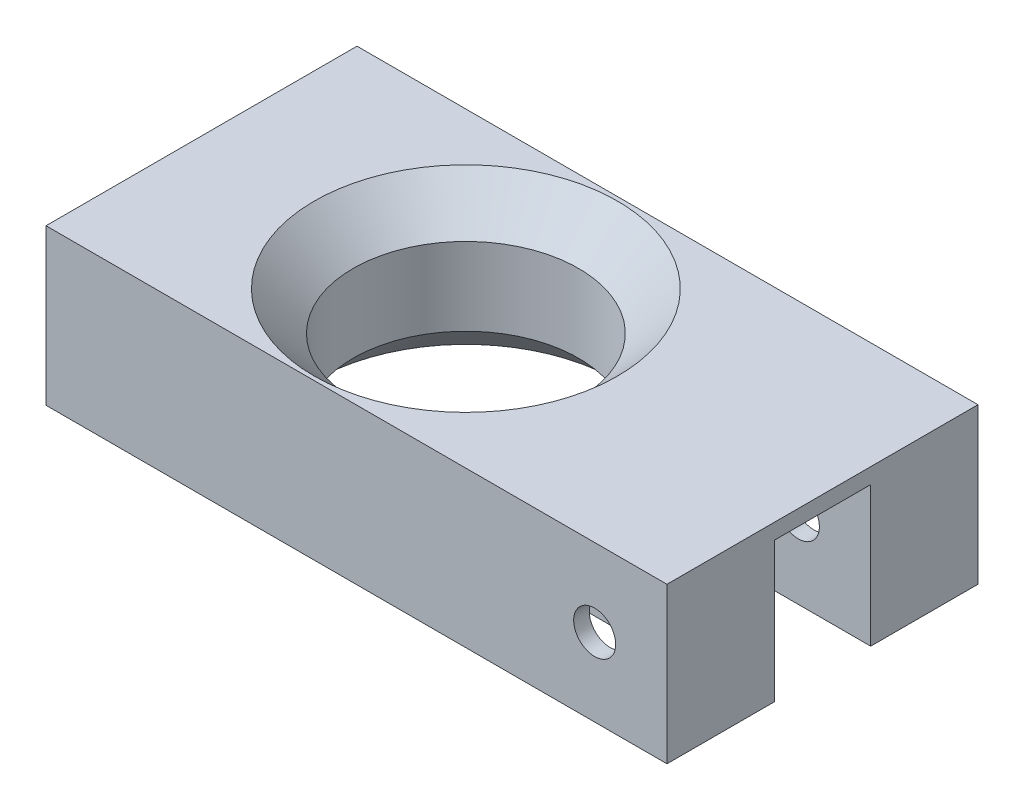
ISO-10303-21;
HEADER;
FILE_DESCRIPTION(('STEP AP214'),'2;1');
FILE_NAME('part.step','',(''),(''),'','','');
FILE_SCHEMA(('AUTOMOTIVE_DESIGN { 1 0 10303 214 1 1 1 1 }'));
ENDSEC;
DATA;
#1=APPLICATION_CONTEXT('core data for automotive mechanical design processes');
#2=APPLICATION_PROTOCOL_DEFINITION('international standard','automotive_design',2000,#1);
#3=PRODUCT_CONTEXT('',#1,'mechanical');
#4=PRODUCT('Part','Part','',(#3));
#5=PRODUCT_RELATED_PRODUCT_CATEGORY('part','',(#4));
#6=PRODUCT_DEFINITION_FORMATION('','',#4);
#7=PRODUCT_DEFINITION_CONTEXT('part definition',#1,'design');
#8=PRODUCT_DEFINITION('design','',#6,#7);
#9=PRODUCT_DEFINITION_SHAPE('','',#8);
#10=(LENGTH_UNIT() NAMED_UNIT(*) SI_UNIT(.MILLI.,.METRE.));
#11=(NAMED_UNIT(*) PLANE_ANGLE_UNIT() SI_UNIT($,.RADIAN.));
#12=(NAMED_UNIT(*) SI_UNIT($,.STERADIAN.) SOLID_ANGLE_UNIT());
#13=UNCERTAINTY_MEASURE_WITH_UNIT(LENGTH_MEASURE(1.E-05),#10,'distance_accuracy_value','');
#14=(GEOMETRIC_REPRESENTATION_CONTEXT(3) GLOBAL_UNCERTAINTY_ASSIGNED_CONTEXT((#13)) GLOBAL_UNIT_ASSIGNED_CONTEXT((#10,
#11,#12)) REPRESENTATION_CONTEXT('',''));
#15=CARTESIAN_POINT('',(0.,0.,0.));
#16=DIRECTION('',(0.,0.,1.));
#17=DIRECTION('',(1.,0.,0.));
#18=AXIS2_PLACEMENT_3D('',#15,#16,#17);
#19=CARTESIAN_POINT('',(0.,10.,39.7015444888983));
#20=DIRECTION('',(0.,0.,-1.));
#21=DIRECTION('',(-1.,0.,0.));
#22=AXIS2_PLACEMENT_3D('',#19,#20,#21);
#23=PLANE('',#22);
#24=CARTESIAN_POINT('',(-2.86835146544696,5.,39.7015444888983));
#25=DIRECTION('',(0.,0.,1.));
#26=DIRECTION('',(1.,0.,0.));
#27=AXIS2_PLACEMENT_3D('',#24,#25,#26);
#28=CIRCLE('',#27,1.35);
#29=CARTESIAN_POINT('',(-1.51835146544696,5.,39.7015444888983));
#30=VERTEX_POINT('',#29);
#31=EDGE_CURVE('E194',#30,#30,#28,.T.);
#32=ORIENTED_EDGE('',*,*,#31,.F.);
#33=EDGE_LOOP('',(#32));
#34=FACE_BOUND('',#33,.T.);
#35=DIRECTION('',(0.,1.,0.));
#36=VECTOR('',#35,1.);
#37=CARTESIAN_POINT('',(-38.1497596240148,10.,39.7015444888983));
#38=LINE('',#37,#36);
#39=CARTESIAN_POINT('',(-38.1497596240148,0.,39.7015444888983));
#40=VERTEX_POINT('',#39);
#41=CARTESIAN_POINT('',(-38.1497596240148,10.,39.7015444888983));
#42=VERTEX_POINT('',#41);
#43=EDGE_CURVE('E314',#40,#42,#38,.T.);
#44=ORIENTED_EDGE('',*,*,#43,.F.);
#45=DIRECTION('',(1.,0.,0.));
#46=VECTOR('',#45,1.);
#47=CARTESIAN_POINT('',(0.,0.,39.7015444888983));
#48=LINE('',#47,#46);
#49=CARTESIAN_POINT('',(1.78164853455304,0.,39.7015444888983));
#50=VERTEX_POINT('',#49);
#51=EDGE_CURVE('E243',#40,#50,#48,.T.);
#52=ORIENTED_EDGE('',*,*,#51,.T.);
#53=DIRECTION('',(0.,1.,0.));
#54=VECTOR('',#53,1.);
#55=CARTESIAN_POINT('',(1.78164853455304,0.,39.7015444888983));
#56=LINE('',#55,#54);
#57=CARTESIAN_POINT('',(1.78164853455304,10.,39.7015444888983));
#58=VERTEX_POINT('',#57);
#59=EDGE_CURVE('E227',#50,#58,#56,.T.);
#60=ORIENTED_EDGE('',*,*,#59,.T.);
#61=DIRECTION('',(1.,0.,0.));
#62=VECTOR('',#61,1.);
#63=CARTESIAN_POINT('',(0.,10.,39.7015444888983));
#64=LINE('',#63,#62);
#65=EDGE_CURVE('E244',#42,#58,#64,.T.);
#66=ORIENTED_EDGE('',*,*,#65,.F.);
#67=EDGE_LOOP('',(#44,#52,#60,#66));
#68=FACE_BOUND('',#67,.T.);
#69=ADVANCED_FACE('F36',(#34,#68),#23,.F.);
#70=CARTESIAN_POINT('',(0.,10.,19.7015444888983));
#71=DIRECTION('',(0.,0.,-1.));
#72=DIRECTION('',(-1.,0.,0.));
#73=AXIS2_PLACEMENT_3D('',#70,#71,#72);
#74=PLANE('',#73);
#75=CARTESIAN_POINT('',(-2.86835146544696,5.,19.7015444888983));
#76=DIRECTION('',(0.,0.,1.));
#77=DIRECTION('',(1.,0.,0.));
#78=AXIS2_PLACEMENT_3D('',#75,#76,#77);
#79=CIRCLE('',#78,1.35);
#80=CARTESIAN_POINT('',(-1.51835146544696,5.,19.7015444888983));
#81=VERTEX_POINT('',#80);
#82=EDGE_CURVE('E198',#81,#81,#79,.T.);
#83=ORIENTED_EDGE('',*,*,#82,.T.);
#84=EDGE_LOOP('',(#83));
#85=FACE_BOUND('',#84,.T.);
#86=DIRECTION('',(1.,0.,0.));
#87=VECTOR('',#86,1.);
#88=CARTESIAN_POINT('',(0.,0.,19.7015444888983));
#89=LINE('',#88,#87);
#90=CARTESIAN_POINT('',(-38.1497596240148,0.,19.7015444888983));
#91=VERTEX_POINT('',#90);
#92=CARTESIAN_POINT('',(1.78164853455304,0.,19.7015444888983));
#93=VERTEX_POINT('',#92);
#94=EDGE_CURVE('E247',#91,#93,#89,.T.);
#95=ORIENTED_EDGE('',*,*,#94,.F.);
#96=DIRECTION('',(0.,-1.,0.));
#97=VECTOR('',#96,1.);
#98=CARTESIAN_POINT('',(-38.1497596240148,10.,19.7015444888983));
#99=LINE('',#98,#97);
#100=CARTESIAN_POINT('',(-38.1497596240148,10.,19.7015444888983));
#101=VERTEX_POINT('',#100);
#102=EDGE_CURVE('E54',#101,#91,#99,.T.);
#103=ORIENTED_EDGE('',*,*,#102,.F.);
#104=DIRECTION('',(1.,0.,0.));
#105=VECTOR('',#104,1.);
#106=CARTESIAN_POINT('',(0.,10.,19.7015444888983));
#107=LINE('',#106,#105);
#108=CARTESIAN_POINT('',(1.78164853455304,10.,19.7015444888983));
#109=VERTEX_POINT('',#108);
#110=EDGE_CURVE('E246',#101,#109,#107,.T.);
#111=ORIENTED_EDGE('',*,*,#110,.T.);
#112=DIRECTION('',(0.,1.,0.));
#113=VECTOR('',#112,1.);
#114=CARTESIAN_POINT('',(1.78164853455304,0.,19.7015444888983));
#115=LINE('',#114,#113);
#116=EDGE_CURVE('E236',#93,#109,#115,.T.);
#117=ORIENTED_EDGE('',*,*,#116,.F.);
#118=EDGE_LOOP('',(#95,#103,#111,#117));
#119=FACE_BOUND('',#118,.T.);
#120=ADVANCED_FACE('F408',(#85,#119),#74,.T.);
#121=CARTESIAN_POINT('',(0.,10.,0.));
#122=DIRECTION('',(0.,1.,0.));
#123=DIRECTION('',(0.,0.,1.));
#124=AXIS2_PLACEMENT_3D('',#121,#122,#123);
#125=PLANE('',#124);
#126=CARTESIAN_POINT('',(-21.1497596240148,10.,29.7015444888983));
#127=DIRECTION('',(0.,1.,0.));
#128=DIRECTION('',(0.,0.,1.));
#129=AXIS2_PLACEMENT_3D('',#126,#127,#128);
#130=CIRCLE('',#129,9.75000000000001);
#131=CARTESIAN_POINT('',(-21.1497596240148,10.,39.4515444888983));
#132=VERTEX_POINT('',#131);
#133=EDGE_CURVE('E46',#132,#132,#130,.F.);
#134=ORIENTED_EDGE('',*,*,#133,.T.);
#135=EDGE_LOOP('',(#134));
#136=FACE_BOUND('',#135,.T.);
#137=ORIENTED_EDGE('',*,*,#110,.F.);
#138=DIRECTION('',(0.,0.,-1.));
#139=VECTOR('',#138,1.);
#140=CARTESIAN_POINT('',(-38.1497596240148,10.,19.7015444888983));
#141=LINE('',#140,#139);
#142=EDGE_CURVE('E316',#42,#101,#141,.T.);
#143=ORIENTED_EDGE('',*,*,#142,.F.);
#144=ORIENTED_EDGE('',*,*,#65,.T.);
#145=DIRECTION('',(0.,0.,1.));
#146=VECTOR('',#145,1.);
#147=CARTESIAN_POINT('',(1.78164853455304,10.,32.8015444888983));
#148=LINE('',#147,#146);
#149=EDGE_CURVE('E239',#109,#58,#148,.T.);
#150=ORIENTED_EDGE('',*,*,#149,.F.);
#151=EDGE_LOOP('',(#137,#143,#144,#150));
#152=FACE_BOUND('',#151,.T.);
#153=ADVANCED_FACE('F415',(#136,#152),#125,.T.);
#154=CARTESIAN_POINT('',(0.,0.,0.));
#155=DIRECTION('',(0.,1.,0.));
#156=DIRECTION('',(0.,0.,1.));
#157=AXIS2_PLACEMENT_3D('',#154,#155,#156);
#158=PLANE('',#157);
#159=CARTESIAN_POINT('',(-21.1497596240148,0.,29.7015444888983));
#160=DIRECTION('',(0.,1.,0.));
#161=DIRECTION('',(0.,0.,1.));
#162=AXIS2_PLACEMENT_3D('',#159,#160,#161);
#163=CIRCLE('',#162,9.75);
#164=CARTESIAN_POINT('',(-21.1497596240148,0.,39.4515444888983));
#165=VERTEX_POINT('',#164);
#166=EDGE_CURVE('E11',#165,#165,#163,.T.);
#167=ORIENTED_EDGE('',*,*,#166,.T.);
#168=EDGE_LOOP('',(#167));
#169=FACE_BOUND('',#168,.T.);
#170=DIRECTION('',(-0.602687911062155,0.,0.79797699331468));
#171=VECTOR('',#170,1.);
#172=CARTESIAN_POINT('',(9.79317869197855,0.,7.39649195149092));
#173=LINE('',#172,#171);
#174=CARTESIAN_POINT('',(-10.1497596240148,0.,33.8015444888983));
#175=VERTEX_POINT('',#174);
#176=CARTESIAN_POINT('',(-13.8505815636769,0.,38.7015444888983));
#177=VERTEX_POINT('',#176);
#178=EDGE_CURVE('E360',#175,#177,#173,.T.);
#179=ORIENTED_EDGE('',*,*,#178,.T.);
#180=DIRECTION('',(-1.,0.,0.));
#181=VECTOR('',#180,1.);
#182=CARTESIAN_POINT('',(0.,0.,38.7015444888983));
#183=LINE('',#182,#181);
#184=CARTESIAN_POINT('',(0.781648534553044,0.,38.7015444888983));
#185=VERTEX_POINT('',#184);
#186=EDGE_CURVE('E318',#185,#177,#183,.T.);
#187=ORIENTED_EDGE('',*,*,#186,.F.);
#188=DIRECTION('',(0.,0.,-1.));
#189=VECTOR('',#188,1.);
#190=CARTESIAN_POINT('',(0.78164853455305,0.,0.));
#191=LINE('',#190,#189);
#192=CARTESIAN_POINT('',(0.781648534553045,0.,33.8015444888983));
#193=VERTEX_POINT('',#192);
#194=EDGE_CURVE('E353',#185,#193,#191,.T.);
#195=ORIENTED_EDGE('',*,*,#194,.T.);
#196=DIRECTION('',(-1.,0.,0.));
#197=VECTOR('',#196,1.);
#198=CARTESIAN_POINT('',(0.,0.,33.8015444888983));
#199=LINE('',#198,#197);
#200=EDGE_CURVE('E363',#193,#175,#199,.T.);
#201=ORIENTED_EDGE('',*,*,#200,.T.);
#202=EDGE_LOOP('',(#179,#187,#195,#201));
#203=FACE_BOUND('',#202,.T.);
#204=DIRECTION('',(0.602687911062155,0.,0.797976993314679));
#205=VECTOR('',#204,1.);
#206=CARTESIAN_POINT('',(-18.7756134717545,0.,14.180653523854));
#207=LINE('',#206,#205);
#208=CARTESIAN_POINT('',(-13.8505815636769,0.,20.7015444888983));
#209=VERTEX_POINT('',#208);
#210=CARTESIAN_POINT('',(-10.1497596240148,0.,25.6015444888983));
#211=VERTEX_POINT('',#210);
#212=EDGE_CURVE('E333',#209,#211,#207,.T.);
#213=ORIENTED_EDGE('',*,*,#212,.T.);
#214=DIRECTION('',(-1.,0.,0.));
#215=VECTOR('',#214,1.);
#216=CARTESIAN_POINT('',(0.,0.,25.6015444888983));
#217=LINE('',#216,#215);
#218=CARTESIAN_POINT('',(0.781648534553044,0.,25.6015444888983));
#219=VERTEX_POINT('',#218);
#220=EDGE_CURVE('E331',#219,#211,#217,.T.);
#221=ORIENTED_EDGE('',*,*,#220,.F.);
#222=DIRECTION('',(0.,0.,1.));
#223=VECTOR('',#222,1.);
#224=CARTESIAN_POINT('',(0.781648534553044,0.,0.));
#225=LINE('',#224,#223);
#226=CARTESIAN_POINT('',(0.781648534553044,0.,20.7015444888983));
#227=VERTEX_POINT('',#226);
#228=EDGE_CURVE('E323',#227,#219,#225,.T.);
#229=ORIENTED_EDGE('',*,*,#228,.F.);
#230=DIRECTION('',(-1.,0.,0.));
#231=VECTOR('',#230,1.);
#232=CARTESIAN_POINT('',(0.,0.,20.7015444888983));
#233=LINE('',#232,#231);
#234=EDGE_CURVE('E337',#227,#209,#233,.T.);
#235=ORIENTED_EDGE('',*,*,#234,.T.);
#236=EDGE_LOOP('',(#213,#221,#229,#235));
#237=FACE_BOUND('',#236,.T.);
#238=DIRECTION('',(0.,0.,1.));
#239=VECTOR('',#238,1.);
#240=CARTESIAN_POINT('',(-38.1497596240148,0.,19.7015444888983));
#241=LINE('',#240,#239);
#242=EDGE_CURVE('E309',#91,#40,#241,.T.);
#243=ORIENTED_EDGE('',*,*,#242,.F.);
#244=ORIENTED_EDGE('',*,*,#94,.T.);
#245=DIRECTION('',(0.,0.,-1.));
#246=VECTOR('',#245,1.);
#247=CARTESIAN_POINT('',(1.78164853455304,0.,26.6015444888983));
#248=LINE('',#247,#246);
#249=CARTESIAN_POINT('',(1.78164853455304,0.,26.6015444888983));
#250=VERTEX_POINT('',#249);
#251=EDGE_CURVE('E230',#250,#93,#248,.T.);
#252=ORIENTED_EDGE('',*,*,#251,.F.);
#253=DIRECTION('',(-1.,0.,0.));
#254=VECTOR('',#253,1.);
#255=CARTESIAN_POINT('',(0.,0.,26.6015444888983));
#256=LINE('',#255,#254);
#257=CARTESIAN_POINT('',(-6.71835146544696,0.,26.6015444888983));
#258=VERTEX_POINT('',#257);
#259=EDGE_CURVE('E257',#250,#258,#256,.T.);
#260=ORIENTED_EDGE('',*,*,#259,.T.);
#261=DIRECTION('',(0.,0.,1.));
#262=VECTOR('',#261,1.);
#263=CARTESIAN_POINT('',(-6.71835146544696,0.,0.));
#264=LINE('',#263,#262);
#265=CARTESIAN_POINT('',(-6.71835146544696,0.,32.8015444888983));
#266=VERTEX_POINT('',#265);
#267=EDGE_CURVE('E254',#258,#266,#264,.T.);
#268=ORIENTED_EDGE('',*,*,#267,.T.);
#269=DIRECTION('',(-1.,0.,0.));
#270=VECTOR('',#269,1.);
#271=CARTESIAN_POINT('',(0.,0.,32.8015444888983));
#272=LINE('',#271,#270);
#273=CARTESIAN_POINT('',(1.78164853455304,0.,32.8015444888983));
#274=VERTEX_POINT('',#273);
#275=EDGE_CURVE('E251',#274,#266,#272,.T.);
#276=ORIENTED_EDGE('',*,*,#275,.F.);
#277=DIRECTION('',(0.,0.,-1.));
#278=VECTOR('',#277,1.);
#279=CARTESIAN_POINT('',(1.78164853455304,0.,32.8015444888983));
#280=LINE('',#279,#278);
#281=EDGE_CURVE('E224',#50,#274,#280,.T.);
#282=ORIENTED_EDGE('',*,*,#281,.F.);
#283=ORIENTED_EDGE('',*,*,#51,.F.);
#284=EDGE_LOOP('',(#243,#244,#252,#260,#268,#276,#282,#283));
#285=FACE_BOUND('',#284,.T.);
#286=ADVANCED_FACE('F384',(#169,#203,#237,#285),#158,.F.);
#287=CARTESIAN_POINT('',(-2.86835146544696,5.,19.7015444888983));
#288=DIRECTION('',(0.,0.,1.));
#289=DIRECTION('',(1.,0.,0.));
#290=AXIS2_PLACEMENT_3D('',#287,#288,#289);
#291=CYLINDRICAL_SURFACE('',#290,1.35);
#292=ORIENTED_EDGE('',*,*,#82,.F.);
#293=EDGE_LOOP('',(#292));
#294=FACE_BOUND('',#293,.T.);
#295=CARTESIAN_POINT('',(-2.86835146544696,5.,20.7015444888983));
#296=DIRECTION('',(0.,0.,1.));
#297=DIRECTION('',(1.,0.,0.));
#298=AXIS2_PLACEMENT_3D('',#295,#296,#297);
#299=CIRCLE('',#298,1.35);
#300=CARTESIAN_POINT('',(-1.51835146544696,5.,20.7015444888983));
#301=VERTEX_POINT('',#300);
#302=EDGE_CURVE('E278',#301,#301,#299,.F.);
#303=ORIENTED_EDGE('',*,*,#302,.F.);
#304=EDGE_LOOP('',(#303));
#305=FACE_BOUND('',#304,.T.);
#306=ADVANCED_FACE('F448',(#294,#305),#291,.F.);
#307=CARTESIAN_POINT('',(-2.86835146544696,5.,32.8015444888983));
#308=DIRECTION('',(0.,0.,1.));
#309=DIRECTION('',(1.,0.,0.));
#310=AXIS2_PLACEMENT_3D('',#307,#308,#309);
#311=CIRCLE('',#310,1.35);
#312=CARTESIAN_POINT('',(-1.51835146544696,5.,32.8015444888983));
#313=VERTEX_POINT('',#312);
#314=EDGE_CURVE('E209',#313,#313,#311,.T.);
#315=ORIENTED_EDGE('',*,*,#314,.F.);
#316=EDGE_LOOP('',(#315));
#317=FACE_BOUND('',#316,.T.);
#318=CARTESIAN_POINT('',(-2.86835146544696,5.,33.8015444888983));
#319=DIRECTION('',(0.,0.,1.));
#320=DIRECTION('',(1.,0.,0.));
#321=AXIS2_PLACEMENT_3D('',#318,#319,#320);
#322=CIRCLE('',#321,1.35);
#323=CARTESIAN_POINT('',(-1.51835146544696,5.,33.8015444888983));
#324=VERTEX_POINT('',#323);
#325=EDGE_CURVE('E272',#324,#324,#322,.F.);
#326=ORIENTED_EDGE('',*,*,#325,.F.);
#327=EDGE_LOOP('',(#326));
#328=FACE_BOUND('',#327,.T.);
#329=ADVANCED_FACE('F455',(#317,#328),#291,.F.);
#330=CARTESIAN_POINT('',(0.,10.,32.8015444888983));
#331=DIRECTION('',(0.,0.,1.));
#332=DIRECTION('',(1.,0.,0.));
#333=AXIS2_PLACEMENT_3D('',#330,#331,#332);
#334=PLANE('',#333);
#335=ORIENTED_EDGE('',*,*,#314,.T.);
#336=EDGE_LOOP('',(#335));
#337=FACE_BOUND('',#336,.T.);
#338=DIRECTION('',(0.,-1.,0.));
#339=VECTOR('',#338,1.);
#340=CARTESIAN_POINT('',(-6.71835146544696,10.,32.8015444888983));
#341=LINE('',#340,#339);
#342=CARTESIAN_POINT('',(-6.71835146544696,9.,32.8015444888983));
#343=VERTEX_POINT('',#342);
#344=EDGE_CURVE('E262',#343,#266,#341,.T.);
#345=ORIENTED_EDGE('',*,*,#344,.F.);
#346=DIRECTION('',(-1.,0.,0.));
#347=VECTOR('',#346,1.);
#348=CARTESIAN_POINT('',(-6.71835146544696,9.,32.8015444888983));
#349=LINE('',#348,#347);
#350=CARTESIAN_POINT('',(1.78164853455304,9.,32.8015444888983));
#351=VERTEX_POINT('',#350);
#352=EDGE_CURVE('E221',#351,#343,#349,.T.);
#353=ORIENTED_EDGE('',*,*,#352,.F.);
#354=DIRECTION('',(0.,1.,0.));
#355=VECTOR('',#354,1.);
#356=CARTESIAN_POINT('',(1.78164853455304,0.,32.8015444888983));
#357=LINE('',#356,#355);
#358=EDGE_CURVE('E228',#274,#351,#357,.T.);
#359=ORIENTED_EDGE('',*,*,#358,.F.);
#360=ORIENTED_EDGE('',*,*,#275,.T.);
#361=EDGE_LOOP('',(#345,#353,#359,#360));
#362=FACE_BOUND('',#361,.T.);
#363=ADVANCED_FACE('F421',(#337,#362),#334,.F.);
#364=CARTESIAN_POINT('',(-6.71835146544696,10.,0.));
#365=DIRECTION('',(1.,0.,0.));
#366=DIRECTION('',(0.,0.,-1.));
#367=AXIS2_PLACEMENT_3D('',#364,#365,#366);
#368=PLANE('',#367);
#369=DIRECTION('',(0.,-1.,0.));
#370=VECTOR('',#369,1.);
#371=CARTESIAN_POINT('',(-6.71835146544696,10.,26.6015444888983));
#372=LINE('',#371,#370);
#373=CARTESIAN_POINT('',(-6.71835146544696,9.,26.6015444888983));
#374=VERTEX_POINT('',#373);
#375=EDGE_CURVE('E249',#374,#258,#372,.T.);
#376=ORIENTED_EDGE('',*,*,#375,.F.);
#377=DIRECTION('',(0.,0.,-1.));
#378=VECTOR('',#377,1.);
#379=CARTESIAN_POINT('',(-6.71835146544696,9.,32.8015444888983));
#380=LINE('',#379,#378);
#381=EDGE_CURVE('E212',#343,#374,#380,.T.);
#382=ORIENTED_EDGE('',*,*,#381,.F.);
#383=ORIENTED_EDGE('',*,*,#344,.T.);
#384=ORIENTED_EDGE('',*,*,#267,.F.);
#385=EDGE_LOOP('',(#376,#382,#383,#384));
#386=FACE_BOUND('',#385,.T.);
#387=ADVANCED_FACE('F463',(#386),#368,.T.);
#388=CARTESIAN_POINT('',(0.,10.,26.6015444888983));
#389=DIRECTION('',(0.,0.,1.));
#390=DIRECTION('',(1.,0.,0.));
#391=AXIS2_PLACEMENT_3D('',#388,#389,#390);
#392=PLANE('',#391);
#393=CARTESIAN_POINT('',(-2.86835146544696,5.,26.6015444888983));
#394=DIRECTION('',(0.,0.,1.));
#395=DIRECTION('',(1.,0.,0.));
#396=AXIS2_PLACEMENT_3D('',#393,#394,#395);
#397=CIRCLE('',#396,1.35);
#398=CARTESIAN_POINT('',(-1.51835146544696,5.,26.6015444888983));
#399=VERTEX_POINT('',#398);
#400=EDGE_CURVE('E205',#399,#399,#397,.T.);
#401=ORIENTED_EDGE('',*,*,#400,.F.);
#402=EDGE_LOOP('',(#401));
#403=FACE_BOUND('',#402,.T.);
#404=ORIENTED_EDGE('',*,*,#259,.F.);
#405=DIRECTION('',(0.,1.,0.));
#406=VECTOR('',#405,1.);
#407=CARTESIAN_POINT('',(1.78164853455304,0.,26.6015444888983));
#408=LINE('',#407,#406);
#409=CARTESIAN_POINT('',(1.78164853455304,9.,26.6015444888983));
#410=VERTEX_POINT('',#409);
#411=EDGE_CURVE('E235',#250,#410,#408,.T.);
#412=ORIENTED_EDGE('',*,*,#411,.T.);
#413=DIRECTION('',(1.,0.,0.));
#414=VECTOR('',#413,1.);
#415=CARTESIAN_POINT('',(-6.71835146544696,9.,26.6015444888983));
#416=LINE('',#415,#414);
#417=EDGE_CURVE('E215',#374,#410,#416,.T.);
#418=ORIENTED_EDGE('',*,*,#417,.F.);
#419=ORIENTED_EDGE('',*,*,#375,.T.);
#420=EDGE_LOOP('',(#404,#412,#418,#419));
#421=FACE_BOUND('',#420,.T.);
#422=ADVANCED_FACE('F436',(#403,#421),#392,.T.);
#423=CARTESIAN_POINT('',(-21.1497596240148,0.,29.7015444888983));
#424=DIRECTION('',(0.,1.,0.));
#425=DIRECTION('',(0.,0.,1.));
#426=AXIS2_PLACEMENT_3D('',#423,#424,#425);
#427=CYLINDRICAL_SURFACE('',#426,7.25);
#428=CARTESIAN_POINT('',(-21.1497596240148,7.49999999999999,29.7015444888983));
#429=DIRECTION('',(0.,1.,0.));
#430=DIRECTION('',(0.,0.,1.));
#431=AXIS2_PLACEMENT_3D('',#428,#429,#430);
#432=CIRCLE('',#431,7.25);
#433=CARTESIAN_POINT('',(-21.1497596240148,7.49999999999999,36.9515444888983));
#434=VERTEX_POINT('',#433);
#435=EDGE_CURVE('E267',#434,#434,#432,.T.);
#436=ORIENTED_EDGE('',*,*,#435,.T.);
#437=EDGE_LOOP('',(#436));
#438=FACE_BOUND('',#437,.T.);
#439=CARTESIAN_POINT('',(-21.1497596240148,2.50000000000001,29.7015444888983));
#440=DIRECTION('',(0.,1.,0.));
#441=DIRECTION('',(0.,0.,1.));
#442=AXIS2_PLACEMENT_3D('',#439,#440,#441);
#443=CIRCLE('',#442,7.25);
#444=CARTESIAN_POINT('',(-21.1497596240148,2.50000000000001,36.9515444888983));
#445=VERTEX_POINT('',#444);
#446=EDGE_CURVE('E264',#445,#445,#443,.F.);
#447=ORIENTED_EDGE('',*,*,#446,.T.);
#448=EDGE_LOOP('',(#447));
#449=FACE_BOUND('',#448,.T.);
#450=ADVANCED_FACE('F428',(#438,#449),#427,.F.);
#451=CARTESIAN_POINT('',(-21.1497596240148,7.49999999999999,29.7015444888983));
#452=DIRECTION('',(0.,1.,0.));
#453=DIRECTION('',(0.,0.,1.));
#454=AXIS2_PLACEMENT_3D('',#451,#452,#453);
#455=CONICAL_SURFACE('',#454,7.25,0.78539816339745);
#456=ORIENTED_EDGE('',*,*,#133,.F.);
#457=EDGE_LOOP('',(#456));
#458=FACE_BOUND('',#457,.T.);
#459=ORIENTED_EDGE('',*,*,#435,.F.);
#460=EDGE_LOOP('',(#459));
#461=FACE_BOUND('',#460,.T.);
#462=ADVANCED_FACE('F424',(#458,#461),#455,.F.);
#463=CARTESIAN_POINT('',(-21.1497596240148,0.,29.7015444888983));
#464=DIRECTION('',(0.,-1.,0.));
#465=DIRECTION('',(0.,0.,-1.));
#466=AXIS2_PLACEMENT_3D('',#463,#464,#465);
#467=CONICAL_SURFACE('',#466,9.75,0.785398163397446);
#468=ORIENTED_EDGE('',*,*,#446,.F.);
#469=EDGE_LOOP('',(#468));
#470=FACE_BOUND('',#469,.T.);
#471=ORIENTED_EDGE('',*,*,#166,.F.);
#472=EDGE_LOOP('',(#471));
#473=FACE_BOUND('',#472,.T.);
#474=ADVANCED_FACE('F39',(#470,#473),#467,.F.);
#475=CARTESIAN_POINT('',(1.78164853455304,0.,0.));
#476=DIRECTION('',(1.,0.,0.));
#477=DIRECTION('',(0.,0.,-1.));
#478=AXIS2_PLACEMENT_3D('',#475,#476,#477);
#479=PLANE('',#478);
#480=ORIENTED_EDGE('',*,*,#358,.T.);
#481=DIRECTION('',(0.,0.,1.));
#482=VECTOR('',#481,1.);
#483=CARTESIAN_POINT('',(1.78164853455304,9.,32.8015444888983));
#484=LINE('',#483,#482);
#485=EDGE_CURVE('E218',#410,#351,#484,.T.);
#486=ORIENTED_EDGE('',*,*,#485,.F.);
#487=ORIENTED_EDGE('',*,*,#411,.F.);
#488=ORIENTED_EDGE('',*,*,#251,.T.);
#489=ORIENTED_EDGE('',*,*,#116,.T.);
#490=ORIENTED_EDGE('',*,*,#149,.T.);
#491=ORIENTED_EDGE('',*,*,#59,.F.);
#492=ORIENTED_EDGE('',*,*,#281,.T.);
#493=EDGE_LOOP('',(#480,#486,#487,#488,#489,#490,#491,#492));
#494=FACE_BOUND('',#493,.T.);
#495=ADVANCED_FACE('F434',(#494),#479,.T.);
#496=CARTESIAN_POINT('',(0.,9.,0.));
#497=DIRECTION('',(0.,-1.,0.));
#498=DIRECTION('',(0.,0.,-1.));
#499=AXIS2_PLACEMENT_3D('',#496,#497,#498);
#500=PLANE('',#499);
#501=ORIENTED_EDGE('',*,*,#381,.T.);
#502=ORIENTED_EDGE('',*,*,#417,.T.);
#503=ORIENTED_EDGE('',*,*,#485,.T.);
#504=ORIENTED_EDGE('',*,*,#352,.T.);
#505=EDGE_LOOP('',(#501,#502,#503,#504));
#506=FACE_BOUND('',#505,.T.);
#507=ADVANCED_FACE('F478',(#506),#500,.T.);
#508=CARTESIAN_POINT('',(-2.86835146544696,5.,25.6015444888983));
#509=DIRECTION('',(0.,0.,1.));
#510=DIRECTION('',(1.,0.,0.));
#511=AXIS2_PLACEMENT_3D('',#508,#509,#510);
#512=CIRCLE('',#511,1.35);
#513=CARTESIAN_POINT('',(-1.51835146544696,5.,25.6015444888983));
#514=VERTEX_POINT('',#513);
#515=EDGE_CURVE('E41',#514,#514,#512,.F.);
#516=ORIENTED_EDGE('',*,*,#515,.T.);
#517=EDGE_LOOP('',(#516));
#518=FACE_BOUND('',#517,.T.);
#519=ORIENTED_EDGE('',*,*,#400,.T.);
#520=EDGE_LOOP('',(#519));
#521=FACE_BOUND('',#520,.T.);
#522=ADVANCED_FACE('F458',(#518,#521),#291,.F.);
#523=CARTESIAN_POINT('',(-2.86835146544696,5.,38.7015444888983));
#524=DIRECTION('',(0.,0.,1.));
#525=DIRECTION('',(1.,0.,0.));
#526=AXIS2_PLACEMENT_3D('',#523,#524,#525);
#527=CIRCLE('',#526,1.35);
#528=CARTESIAN_POINT('',(-1.51835146544696,5.,38.7015444888983));
#529=VERTEX_POINT('',#528);
#530=EDGE_CURVE('E275',#529,#529,#527,.F.);
#531=ORIENTED_EDGE('',*,*,#530,.T.);
#532=EDGE_LOOP('',(#531));
#533=FACE_BOUND('',#532,.T.);
#534=ORIENTED_EDGE('',*,*,#31,.T.);
#535=EDGE_LOOP('',(#534));
#536=FACE_BOUND('',#535,.T.);
#537=ADVANCED_FACE('F663',(#533,#536),#291,.F.);
#538=CARTESIAN_POINT('',(0.,9.,38.7015444888983));
#539=DIRECTION('',(0.,0.,1.));
#540=DIRECTION('',(1.,0.,0.));
#541=AXIS2_PLACEMENT_3D('',#538,#539,#540);
#542=PLANE('',#541);
#543=ORIENTED_EDGE('',*,*,#186,.T.);
#544=DIRECTION('',(0.,-1.,0.));
#545=VECTOR('',#544,1.);
#546=CARTESIAN_POINT('',(-13.8505815636769,9.,38.7015444888983));
#547=LINE('',#546,#545);
#548=CARTESIAN_POINT('',(-13.8505815636769,9.,38.7015444888983));
#549=VERTEX_POINT('',#548);
#550=EDGE_CURVE('E292',#549,#177,#547,.T.);
#551=ORIENTED_EDGE('',*,*,#550,.F.);
#552=DIRECTION('',(-1.,0.,0.));
#553=VECTOR('',#552,1.);
#554=CARTESIAN_POINT('',(0.,9.,38.7015444888983));
#555=LINE('',#554,#553);
#556=CARTESIAN_POINT('',(0.781648534553044,9.,38.7015444888983));
#557=VERTEX_POINT('',#556);
#558=EDGE_CURVE('E349',#557,#549,#555,.T.);
#559=ORIENTED_EDGE('',*,*,#558,.F.);
#560=DIRECTION('',(0.,-1.,0.));
#561=VECTOR('',#560,1.);
#562=CARTESIAN_POINT('',(0.781648534553044,9.,38.7015444888983));
#563=LINE('',#562,#561);
#564=EDGE_CURVE('E334',#557,#185,#563,.T.);
#565=ORIENTED_EDGE('',*,*,#564,.T.);
#566=EDGE_LOOP('',(#543,#551,#559,#565));
#567=FACE_BOUND('',#566,.T.);
#568=ORIENTED_EDGE('',*,*,#530,.F.);
#569=EDGE_LOOP('',(#568));
#570=FACE_BOUND('',#569,.T.);
#571=ADVANCED_FACE('F395',(#567,#570),#542,.F.);
#572=CARTESIAN_POINT('',(0.,9.,33.8015444888983));
#573=DIRECTION('',(0.,0.,1.));
#574=DIRECTION('',(1.,0.,0.));
#575=AXIS2_PLACEMENT_3D('',#572,#573,#574);
#576=PLANE('',#575);
#577=ORIENTED_EDGE('',*,*,#200,.F.);
#578=DIRECTION('',(0.,-1.,0.));
#579=VECTOR('',#578,1.);
#580=CARTESIAN_POINT('',(0.781648534553045,9.,33.8015444888983));
#581=LINE('',#580,#579);
#582=CARTESIAN_POINT('',(0.781648534553045,9.,33.8015444888983));
#583=VERTEX_POINT('',#582);
#584=EDGE_CURVE('E369',#583,#193,#581,.T.);
#585=ORIENTED_EDGE('',*,*,#584,.F.);
#586=DIRECTION('',(-1.,0.,0.));
#587=VECTOR('',#586,1.);
#588=CARTESIAN_POINT('',(0.,9.,33.8015444888983));
#589=LINE('',#588,#587);
#590=CARTESIAN_POINT('',(-10.1497596240148,9.,33.8015444888983));
#591=VERTEX_POINT('',#590);
#592=EDGE_CURVE('E355',#583,#591,#589,.T.);
#593=ORIENTED_EDGE('',*,*,#592,.T.);
#594=DIRECTION('',(0.,-1.,0.));
#595=VECTOR('',#594,1.);
#596=CARTESIAN_POINT('',(-10.1497596240148,9.,33.8015444888983));
#597=LINE('',#596,#595);
#598=EDGE_CURVE('E370',#591,#175,#597,.T.);
#599=ORIENTED_EDGE('',*,*,#598,.T.);
#600=EDGE_LOOP('',(#577,#585,#593,#599));
#601=FACE_BOUND('',#600,.T.);
#602=ORIENTED_EDGE('',*,*,#325,.T.);
#603=EDGE_LOOP('',(#602));
#604=FACE_BOUND('',#603,.T.);
#605=ADVANCED_FACE('F388',(#601,#604),#576,.T.);
#606=CARTESIAN_POINT('',(0.78164853455305,9.,0.));
#607=DIRECTION('',(-1.,0.,0.));
#608=DIRECTION('',(0.,0.,1.));
#609=AXIS2_PLACEMENT_3D('',#606,#607,#608);
#610=PLANE('',#609);
#611=ORIENTED_EDGE('',*,*,#194,.F.);
#612=ORIENTED_EDGE('',*,*,#564,.F.);
#613=DIRECTION('',(0.,0.,-1.));
#614=VECTOR('',#613,1.);
#615=CARTESIAN_POINT('',(0.78164853455305,9.,0.));
#616=LINE('',#615,#614);
#617=EDGE_CURVE('E357',#557,#583,#616,.T.);
#618=ORIENTED_EDGE('',*,*,#617,.T.);
#619=ORIENTED_EDGE('',*,*,#584,.T.);
#620=EDGE_LOOP('',(#611,#612,#618,#619));
#621=FACE_BOUND('',#620,.T.);
#622=ADVANCED_FACE('F397',(#621),#610,.T.);
#623=CARTESIAN_POINT('',(9.79317869197855,9.,7.39649195149092));
#624=DIRECTION('',(0.79797699331468,0.,0.602687911062155));
#625=DIRECTION('',(0.602687911062155,0.,-0.79797699331468));
#626=AXIS2_PLACEMENT_3D('',#623,#624,#625);
#627=PLANE('',#626);
#628=ORIENTED_EDGE('',*,*,#178,.F.);
#629=ORIENTED_EDGE('',*,*,#598,.F.);
#630=DIRECTION('',(-0.602687911062155,0.,0.79797699331468));
#631=VECTOR('',#630,1.);
#632=CARTESIAN_POINT('',(9.79317869197855,9.,7.39649195149092));
#633=LINE('',#632,#631);
#634=EDGE_CURVE('E352',#591,#549,#633,.T.);
#635=ORIENTED_EDGE('',*,*,#634,.T.);
#636=ORIENTED_EDGE('',*,*,#550,.T.);
#637=EDGE_LOOP('',(#628,#629,#635,#636));
#638=FACE_BOUND('',#637,.T.);
#639=ADVANCED_FACE('F378',(#638),#627,.T.);
#640=CARTESIAN_POINT('',(0.,9.,0.));
#641=DIRECTION('',(0.,-1.,0.));
#642=DIRECTION('',(0.,0.,-1.));
#643=AXIS2_PLACEMENT_3D('',#640,#641,#642);
#644=PLANE('',#643);
#645=ORIENTED_EDGE('',*,*,#558,.T.);
#646=ORIENTED_EDGE('',*,*,#634,.F.);
#647=ORIENTED_EDGE('',*,*,#592,.F.);
#648=ORIENTED_EDGE('',*,*,#617,.F.);
#649=EDGE_LOOP('',(#645,#646,#647,#648));
#650=FACE_BOUND('',#649,.T.);
#651=ADVANCED_FACE('F394',(#650),#644,.T.);
#652=CARTESIAN_POINT('',(0.,9.,25.6015444888983));
#653=DIRECTION('',(0.,0.,1.));
#654=DIRECTION('',(1.,0.,0.));
#655=AXIS2_PLACEMENT_3D('',#652,#653,#654);
#656=PLANE('',#655);
#657=ORIENTED_EDGE('',*,*,#220,.T.);
#658=DIRECTION('',(0.,-1.,0.));
#659=VECTOR('',#658,1.);
#660=CARTESIAN_POINT('',(-10.1497596240148,9.,25.6015444888983));
#661=LINE('',#660,#659);
#662=CARTESIAN_POINT('',(-10.1497596240148,9.,25.6015444888983));
#663=VERTEX_POINT('',#662);
#664=EDGE_CURVE('E330',#663,#211,#661,.T.);
#665=ORIENTED_EDGE('',*,*,#664,.F.);
#666=DIRECTION('',(-1.,0.,0.));
#667=VECTOR('',#666,1.);
#668=CARTESIAN_POINT('',(0.,9.,25.6015444888983));
#669=LINE('',#668,#667);
#670=CARTESIAN_POINT('',(0.781648534553044,9.,25.6015444888983));
#671=VERTEX_POINT('',#670);
#672=EDGE_CURVE('E319',#671,#663,#669,.T.);
#673=ORIENTED_EDGE('',*,*,#672,.F.);
#674=DIRECTION('',(0.,-1.,0.));
#675=VECTOR('',#674,1.);
#676=CARTESIAN_POINT('',(0.781648534553044,9.,25.6015444888983));
#677=LINE('',#676,#675);
#678=EDGE_CURVE('E276',#671,#219,#677,.T.);
#679=ORIENTED_EDGE('',*,*,#678,.T.);
#680=EDGE_LOOP('',(#657,#665,#673,#679));
#681=FACE_BOUND('',#680,.T.);
#682=ORIENTED_EDGE('',*,*,#515,.F.);
#683=EDGE_LOOP('',(#682));
#684=FACE_BOUND('',#683,.T.);
#685=ADVANCED_FACE('F516',(#681,#684),#656,.F.);
#686=CARTESIAN_POINT('',(0.,9.,20.7015444888983));
#687=DIRECTION('',(0.,0.,1.));
#688=DIRECTION('',(1.,0.,0.));
#689=AXIS2_PLACEMENT_3D('',#686,#687,#688);
#690=PLANE('',#689);
#691=ORIENTED_EDGE('',*,*,#234,.F.);
#692=DIRECTION('',(0.,-1.,0.));
#693=VECTOR('',#692,1.);
#694=CARTESIAN_POINT('',(0.781648534553044,9.,20.7015444888983));
#695=LINE('',#694,#693);
#696=CARTESIAN_POINT('',(0.781648534553044,9.,20.7015444888983));
#697=VERTEX_POINT('',#696);
#698=EDGE_CURVE('E343',#697,#227,#695,.T.);
#699=ORIENTED_EDGE('',*,*,#698,.F.);
#700=DIRECTION('',(-1.,0.,0.));
#701=VECTOR('',#700,1.);
#702=CARTESIAN_POINT('',(0.,9.,20.7015444888983));
#703=LINE('',#702,#701);
#704=CARTESIAN_POINT('',(-13.8505815636769,9.,20.7015444888983));
#705=VERTEX_POINT('',#704);
#706=EDGE_CURVE('E325',#697,#705,#703,.T.);
#707=ORIENTED_EDGE('',*,*,#706,.T.);
#708=DIRECTION('',(0.,-1.,0.));
#709=VECTOR('',#708,1.);
#710=CARTESIAN_POINT('',(-13.8505815636769,9.,20.7015444888983));
#711=LINE('',#710,#709);
#712=EDGE_CURVE('E345',#705,#209,#711,.T.);
#713=ORIENTED_EDGE('',*,*,#712,.T.);
#714=EDGE_LOOP('',(#691,#699,#707,#713));
#715=FACE_BOUND('',#714,.T.);
#716=ORIENTED_EDGE('',*,*,#302,.T.);
#717=EDGE_LOOP('',(#716));
#718=FACE_BOUND('',#717,.T.);
#719=ADVANCED_FACE('F512',(#715,#718),#690,.T.);
#720=CARTESIAN_POINT('',(0.781648534553044,9.,0.));
#721=DIRECTION('',(1.,0.,0.));
#722=DIRECTION('',(0.,0.,-1.));
#723=AXIS2_PLACEMENT_3D('',#720,#721,#722);
#724=PLANE('',#723);
#725=ORIENTED_EDGE('',*,*,#228,.T.);
#726=ORIENTED_EDGE('',*,*,#678,.F.);
#727=DIRECTION('',(0.,0.,1.));
#728=VECTOR('',#727,1.);
#729=CARTESIAN_POINT('',(0.781648534553044,9.,0.));
#730=LINE('',#729,#728);
#731=EDGE_CURVE('E327',#697,#671,#730,.T.);
#732=ORIENTED_EDGE('',*,*,#731,.F.);
#733=ORIENTED_EDGE('',*,*,#698,.T.);
#734=EDGE_LOOP('',(#725,#726,#732,#733));
#735=FACE_BOUND('',#734,.T.);
#736=ADVANCED_FACE('F509',(#735),#724,.F.);
#737=CARTESIAN_POINT('',(-18.7756134717545,9.,14.180653523854));
#738=DIRECTION('',(0.797976993314679,0.,-0.602687911062155));
#739=DIRECTION('',(-0.602687911062156,0.,-0.797976993314679));
#740=AXIS2_PLACEMENT_3D('',#737,#738,#739);
#741=PLANE('',#740);
#742=ORIENTED_EDGE('',*,*,#212,.F.);
#743=ORIENTED_EDGE('',*,*,#712,.F.);
#744=DIRECTION('',(0.602687911062155,0.,0.797976993314679));
#745=VECTOR('',#744,1.);
#746=CARTESIAN_POINT('',(-18.7756134717545,9.,14.180653523854));
#747=LINE('',#746,#745);
#748=EDGE_CURVE('E322',#705,#663,#747,.T.);
#749=ORIENTED_EDGE('',*,*,#748,.T.);
#750=ORIENTED_EDGE('',*,*,#664,.T.);
#751=EDGE_LOOP('',(#742,#743,#749,#750));
#752=FACE_BOUND('',#751,.T.);
#753=ADVANCED_FACE('F505',(#752),#741,.T.);
#754=CARTESIAN_POINT('',(0.,9.,0.));
#755=DIRECTION('',(0.,-1.,0.));
#756=DIRECTION('',(0.,0.,-1.));
#757=AXIS2_PLACEMENT_3D('',#754,#755,#756);
#758=PLANE('',#757);
#759=ORIENTED_EDGE('',*,*,#672,.T.);
#760=ORIENTED_EDGE('',*,*,#748,.F.);
#761=ORIENTED_EDGE('',*,*,#706,.F.);
#762=ORIENTED_EDGE('',*,*,#731,.T.);
#763=EDGE_LOOP('',(#759,#760,#761,#762));
#764=FACE_BOUND('',#763,.T.);
#765=ADVANCED_FACE('F498',(#764),#758,.T.);
#766=CARTESIAN_POINT('',(-38.1497596240148,0.,0.));
#767=DIRECTION('',(-1.,0.,0.));
#768=DIRECTION('',(0.,0.,1.));
#769=AXIS2_PLACEMENT_3D('',#766,#767,#768);
#770=PLANE('',#769);
#771=DIRECTION('',(0.,0.,-1.));
#772=VECTOR('',#771,1.);
#773=CARTESIAN_POINT('',(-38.1497596240148,9.,20.7015444888983));
#774=LINE('',#773,#772);
#775=CARTESIAN_POINT('',(-38.1497596240148,9.,38.7015444888983));
#776=VERTEX_POINT('',#775);
#777=CARTESIAN_POINT('',(-38.1497596240148,9.,20.7015444888983));
#778=VERTEX_POINT('',#777);
#779=EDGE_CURVE('E307',#776,#778,#774,.T.);
#780=ORIENTED_EDGE('',*,*,#779,.F.);
#781=DIRECTION('',(0.,1.,0.));
#782=VECTOR('',#781,1.);
#783=CARTESIAN_POINT('',(-38.1497596240148,9.,38.7015444888983));
#784=LINE('',#783,#782);
#785=CARTESIAN_POINT('',(-38.1497596240148,1.,38.7015444888983));
#786=VERTEX_POINT('',#785);
#787=EDGE_CURVE('E177',#786,#776,#784,.T.);
#788=ORIENTED_EDGE('',*,*,#787,.F.);
#789=DIRECTION('',(0.,0.,1.));
#790=VECTOR('',#789,1.);
#791=CARTESIAN_POINT('',(-38.1497596240148,1.,20.7015444888983));
#792=LINE('',#791,#790);
#793=CARTESIAN_POINT('',(-38.1497596240148,1.,20.7015444888983));
#794=VERTEX_POINT('',#793);
#795=EDGE_CURVE('E174',#794,#786,#792,.T.);
#796=ORIENTED_EDGE('',*,*,#795,.F.);
#797=DIRECTION('',(0.,-1.,0.));
#798=VECTOR('',#797,1.);
#799=CARTESIAN_POINT('',(-38.1497596240148,9.,20.7015444888983));
#800=LINE('',#799,#798);
#801=EDGE_CURVE('E62',#778,#794,#800,.T.);
#802=ORIENTED_EDGE('',*,*,#801,.F.);
#803=EDGE_LOOP('',(#780,#788,#796,#802));
#804=FACE_BOUND('',#803,.T.);
#805=ORIENTED_EDGE('',*,*,#102,.T.);
#806=ORIENTED_EDGE('',*,*,#242,.T.);
#807=ORIENTED_EDGE('',*,*,#43,.T.);
#808=ORIENTED_EDGE('',*,*,#142,.T.);
#809=EDGE_LOOP('',(#805,#806,#807,#808));
#810=FACE_BOUND('',#809,.T.);
#811=ADVANCED_FACE('F175',(#804,#810),#770,.T.);
#812=CARTESIAN_POINT('',(-31.1497596240148,0.,0.));
#813=DIRECTION('',(-1.,0.,0.));
#814=DIRECTION('',(0.,0.,1.));
#815=AXIS2_PLACEMENT_3D('',#812,#813,#814);
#816=PLANE('',#815);
#817=DIRECTION('',(0.,-1.,0.));
#818=VECTOR('',#817,1.);
#819=CARTESIAN_POINT('',(-31.1497596240148,9.,20.7015444888983));
#820=LINE('',#819,#818);
#821=CARTESIAN_POINT('',(-31.1497596240148,9.,20.7015444888983));
#822=VERTEX_POINT('',#821);
#823=CARTESIAN_POINT('',(-31.1497596240148,1.,20.7015444888983));
#824=VERTEX_POINT('',#823);
#825=EDGE_CURVE('E283',#822,#824,#820,.T.);
#826=ORIENTED_EDGE('',*,*,#825,.T.);
#827=DIRECTION('',(0.,0.,1.));
#828=VECTOR('',#827,1.);
#829=CARTESIAN_POINT('',(-31.1497596240148,1.,20.7015444888983));
#830=LINE('',#829,#828);
#831=CARTESIAN_POINT('',(-31.1497596240148,1.,38.7015444888983));
#832=VERTEX_POINT('',#831);
#833=EDGE_CURVE('E193',#824,#832,#830,.T.);
#834=ORIENTED_EDGE('',*,*,#833,.T.);
#835=DIRECTION('',(0.,1.,0.));
#836=VECTOR('',#835,1.);
#837=CARTESIAN_POINT('',(-31.1497596240148,9.,38.7015444888983));
#838=LINE('',#837,#836);
#839=CARTESIAN_POINT('',(-31.1497596240148,9.,38.7015444888983));
#840=VERTEX_POINT('',#839);
#841=EDGE_CURVE('E289',#832,#840,#838,.T.);
#842=ORIENTED_EDGE('',*,*,#841,.T.);
#843=DIRECTION('',(0.,0.,-1.));
#844=VECTOR('',#843,1.);
#845=CARTESIAN_POINT('',(-31.1497596240148,9.,20.7015444888983));
#846=LINE('',#845,#844);
#847=EDGE_CURVE('E297',#840,#822,#846,.T.);
#848=ORIENTED_EDGE('',*,*,#847,.T.);
#849=EDGE_LOOP('',(#826,#834,#842,#848));
#850=FACE_BOUND('',#849,.T.);
#851=ADVANCED_FACE('F305',(#850),#816,.T.);
#852=CARTESIAN_POINT('',(-43.1497596240148,9.,20.7015444888983));
#853=DIRECTION('',(0.,-1.,0.));
#854=DIRECTION('',(0.,0.,-1.));
#855=AXIS2_PLACEMENT_3D('',#852,#853,#854);
#856=PLANE('',#855);
#857=DIRECTION('',(1.,0.,0.));
#858=VECTOR('',#857,1.);
#859=CARTESIAN_POINT('',(-43.1497596240148,9.,38.7015444888983));
#860=LINE('',#859,#858);
#861=EDGE_CURVE('E200',#776,#840,#860,.T.);
#862=ORIENTED_EDGE('',*,*,#861,.F.);
#863=ORIENTED_EDGE('',*,*,#779,.T.);
#864=DIRECTION('',(1.,0.,0.));
#865=VECTOR('',#864,1.);
#866=CARTESIAN_POINT('',(-43.1497596240148,9.,20.7015444888983));
#867=LINE('',#866,#865);
#868=EDGE_CURVE('E188',#778,#822,#867,.T.);
#869=ORIENTED_EDGE('',*,*,#868,.T.);
#870=ORIENTED_EDGE('',*,*,#847,.F.);
#871=EDGE_LOOP('',(#862,#863,#869,#870));
#872=FACE_BOUND('',#871,.T.);
#873=ADVANCED_FACE('F306',(#872),#856,.T.);
#874=CARTESIAN_POINT('',(-43.1497596240148,9.,38.7015444888983));
#875=DIRECTION('',(0.,0.,-1.));
#876=DIRECTION('',(-1.,0.,0.));
#877=AXIS2_PLACEMENT_3D('',#874,#875,#876);
#878=PLANE('',#877);
#879=DIRECTION('',(1.,0.,0.));
#880=VECTOR('',#879,1.);
#881=CARTESIAN_POINT('',(-43.1497596240148,1.,38.7015444888983));
#882=LINE('',#881,#880);
#883=EDGE_CURVE('E195',#786,#832,#882,.T.);
#884=ORIENTED_EDGE('',*,*,#883,.F.);
#885=ORIENTED_EDGE('',*,*,#787,.T.);
#886=ORIENTED_EDGE('',*,*,#861,.T.);
#887=ORIENTED_EDGE('',*,*,#841,.F.);
#888=EDGE_LOOP('',(#884,#885,#886,#887));
#889=FACE_BOUND('',#888,.T.);
#890=ADVANCED_FACE('F302',(#889),#878,.T.);
#891=CARTESIAN_POINT('',(-43.1497596240148,1.,20.7015444888983));
#892=DIRECTION('',(0.,1.,0.));
#893=DIRECTION('',(0.,0.,1.));
#894=AXIS2_PLACEMENT_3D('',#891,#892,#893);
#895=PLANE('',#894);
#896=DIRECTION('',(1.,0.,0.));
#897=VECTOR('',#896,1.);
#898=CARTESIAN_POINT('',(-43.1497596240148,1.,20.7015444888983));
#899=LINE('',#898,#897);
#900=EDGE_CURVE('E186',#794,#824,#899,.T.);
#901=ORIENTED_EDGE('',*,*,#900,.F.);
#902=ORIENTED_EDGE('',*,*,#795,.T.);
#903=ORIENTED_EDGE('',*,*,#883,.T.);
#904=ORIENTED_EDGE('',*,*,#833,.F.);
#905=EDGE_LOOP('',(#901,#902,#903,#904));
#906=FACE_BOUND('',#905,.T.);
#907=ADVANCED_FACE('F191',(#906),#895,.T.);
#908=CARTESIAN_POINT('',(-43.1497596240148,9.,20.7015444888983));
#909=DIRECTION('',(0.,0.,1.));
#910=DIRECTION('',(1.,0.,0.));
#911=AXIS2_PLACEMENT_3D('',#908,#909,#910);
#912=PLANE('',#911);
#913=ORIENTED_EDGE('',*,*,#868,.F.);
#914=ORIENTED_EDGE('',*,*,#801,.T.);
#915=ORIENTED_EDGE('',*,*,#900,.T.);
#916=ORIENTED_EDGE('',*,*,#825,.F.);
#917=EDGE_LOOP('',(#913,#914,#915,#916));
#918=FACE_BOUND('',#917,.T.);
#919=ADVANCED_FACE('F184',(#918),#912,.T.);
#920=CLOSED_SHELL('',(#69,#120,#153,#286,#306,#329,#363,#387,#422,#450,#462,#474,#495,#507,#522,
#537,#571,#605,#622,#639,#651,#685,#719,#736,#753,#765,#811,#851,#873,#890,#907,#919));
#921=MANIFOLD_SOLID_BREP('B2',#920);
#922=ADVANCED_BREP_SHAPE_REPRESENTATION('',(#18,#921),#14);
#923=SHAPE_DEFINITION_REPRESENTATION(#9,#922);
ENDSEC;
END-ISO-10303-21;
